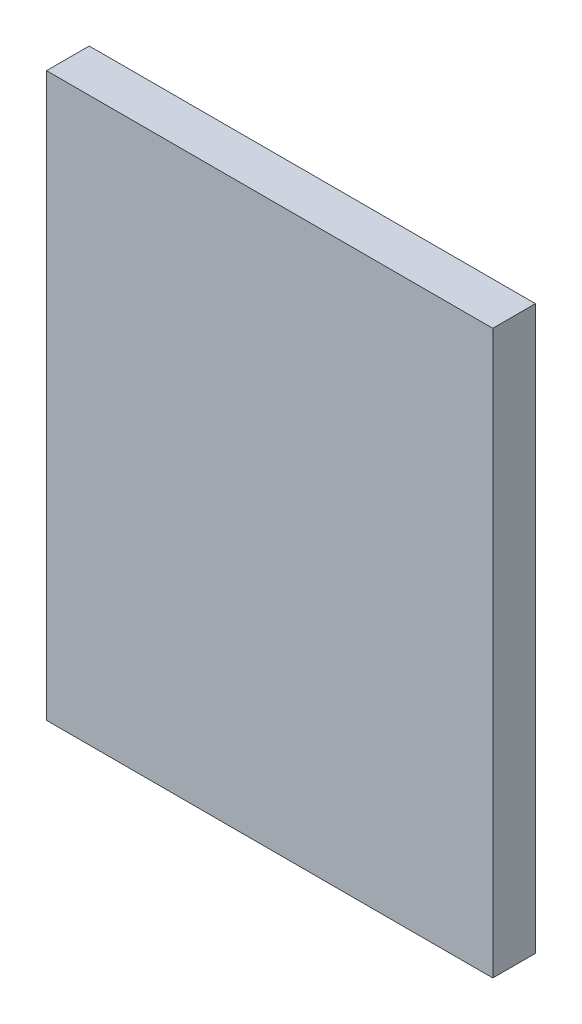
ISO-10303-21;
HEADER;
FILE_DESCRIPTION(('STEP AP214'),'2;1');
FILE_NAME('part.step','',(''),(''),'','','');
FILE_SCHEMA(('AUTOMOTIVE_DESIGN { 1 0 10303 214 1 1 1 1 }'));
ENDSEC;
DATA;
#1=APPLICATION_CONTEXT('core data for automotive mechanical design processes');
#2=APPLICATION_PROTOCOL_DEFINITION('international standard','automotive_design',2000,#1);
#3=PRODUCT_CONTEXT('',#1,'mechanical');
#4=PRODUCT('Part','Part','',(#3));
#5=PRODUCT_RELATED_PRODUCT_CATEGORY('part','',(#4));
#6=PRODUCT_DEFINITION_FORMATION('','',#4);
#7=PRODUCT_DEFINITION_CONTEXT('part definition',#1,'design');
#8=PRODUCT_DEFINITION('design','',#6,#7);
#9=PRODUCT_DEFINITION_SHAPE('','',#8);
#10=(LENGTH_UNIT() NAMED_UNIT(*) SI_UNIT(.MILLI.,.METRE.));
#11=(NAMED_UNIT(*) PLANE_ANGLE_UNIT() SI_UNIT($,.RADIAN.));
#12=(NAMED_UNIT(*) SI_UNIT($,.STERADIAN.) SOLID_ANGLE_UNIT());
#13=UNCERTAINTY_MEASURE_WITH_UNIT(LENGTH_MEASURE(1.E-05),#10,'distance_accuracy_value','');
#14=(GEOMETRIC_REPRESENTATION_CONTEXT(3) GLOBAL_UNCERTAINTY_ASSIGNED_CONTEXT((#13)) GLOBAL_UNIT_ASSIGNED_CONTEXT((#10,
#11,#12)) REPRESENTATION_CONTEXT('',''));
#15=CARTESIAN_POINT('',(0.,0.,0.));
#16=DIRECTION('',(0.,0.,1.));
#17=DIRECTION('',(1.,0.,0.));
#18=AXIS2_PLACEMENT_3D('',#15,#16,#17);
#19=CARTESIAN_POINT('',(19.4,0.,-35.625));
#20=DIRECTION('',(0.,0.,-1.));
#21=DIRECTION('',(-1.,0.,0.));
#22=AXIS2_PLACEMENT_3D('',#19,#20,#21);
#23=PLANE('',#22);
#24=DIRECTION('',(0.,1.,0.));
#25=VECTOR('',#24,1.);
#26=CARTESIAN_POINT('',(12.9,-7.25,-35.625));
#27=LINE('',#26,#25);
#28=CARTESIAN_POINT('',(12.9,-7.25,-35.625));
#29=VERTEX_POINT('',#28);
#30=CARTESIAN_POINT('',(12.9,7.25,-35.625));
#31=VERTEX_POINT('',#30);
#32=EDGE_CURVE('E80',#29,#31,#27,.T.);
#33=ORIENTED_EDGE('',*,*,#32,.F.);
#34=DIRECTION('',(1.,0.,0.));
#35=VECTOR('',#34,1.);
#36=CARTESIAN_POINT('',(25.9,-7.25,-35.625));
#37=LINE('',#36,#35);
#38=CARTESIAN_POINT('',(24.4,-7.25,-35.625));
#39=VERTEX_POINT('',#38);
#40=EDGE_CURVE('E68',#39,#29,#37,.F.);
#41=ORIENTED_EDGE('',*,*,#40,.F.);
#42=DIRECTION('',(0.,1.,0.));
#43=VECTOR('',#42,1.);
#44=CARTESIAN_POINT('',(24.4,7.25,-35.625));
#45=LINE('',#44,#43);
#46=CARTESIAN_POINT('',(24.4,7.25,-35.625));
#47=VERTEX_POINT('',#46);
#48=EDGE_CURVE('E55',#47,#39,#45,.F.);
#49=ORIENTED_EDGE('',*,*,#48,.F.);
#50=DIRECTION('',(1.,0.,0.));
#51=VECTOR('',#50,1.);
#52=CARTESIAN_POINT('',(12.9,7.25,-35.625));
#53=LINE('',#52,#51);
#54=EDGE_CURVE('E20',#31,#47,#53,.T.);
#55=ORIENTED_EDGE('',*,*,#54,.F.);
#56=EDGE_LOOP('',(#33,#41,#49,#55));
#57=FACE_BOUND('',#56,.T.);
#58=ADVANCED_FACE('F17',(#57),#23,.F.);
#59=CARTESIAN_POINT('',(12.9,7.25,-36.425));
#60=DIRECTION('',(0.,1.,0.));
#61=DIRECTION('',(0.,0.,1.));
#62=AXIS2_PLACEMENT_3D('',#59,#60,#61);
#63=PLANE('',#62);
#64=DIRECTION('',(0.,0.,-1.));
#65=VECTOR('',#64,1.);
#66=CARTESIAN_POINT('',(24.4,7.25,-36.425));
#67=LINE('',#66,#65);
#68=CARTESIAN_POINT('',(24.4,7.25,-36.725));
#69=VERTEX_POINT('',#68);
#70=EDGE_CURVE('E61',#69,#47,#67,.F.);
#71=ORIENTED_EDGE('',*,*,#70,.F.);
#72=DIRECTION('',(-1.,0.,0.));
#73=VECTOR('',#72,1.);
#74=CARTESIAN_POINT('',(19.4,7.25,-36.725));
#75=LINE('',#74,#73);
#76=CARTESIAN_POINT('',(12.9,7.25,-36.725));
#77=VERTEX_POINT('',#76);
#78=EDGE_CURVE('E83',#77,#69,#75,.F.);
#79=ORIENTED_EDGE('',*,*,#78,.F.);
#80=DIRECTION('',(0.,0.,1.));
#81=VECTOR('',#80,1.);
#82=CARTESIAN_POINT('',(12.9,7.25,-36.425));
#83=LINE('',#82,#81);
#84=EDGE_CURVE('E64',#31,#77,#83,.F.);
#85=ORIENTED_EDGE('',*,*,#84,.F.);
#86=ORIENTED_EDGE('',*,*,#54,.T.);
#87=EDGE_LOOP('',(#71,#79,#85,#86));
#88=FACE_BOUND('',#87,.T.);
#89=ADVANCED_FACE('F60',(#88),#63,.T.);
#90=CARTESIAN_POINT('',(24.4,7.25,-36.425));
#91=DIRECTION('',(1.,0.,0.));
#92=DIRECTION('',(0.,0.,-1.));
#93=AXIS2_PLACEMENT_3D('',#90,#91,#92);
#94=PLANE('',#93);
#95=DIRECTION('',(0.,0.,-1.));
#96=VECTOR('',#95,1.);
#97=CARTESIAN_POINT('',(24.4,-7.25,-36.425));
#98=LINE('',#97,#96);
#99=CARTESIAN_POINT('',(24.4,-7.25,-36.725));
#100=VERTEX_POINT('',#99);
#101=EDGE_CURVE('E70',#100,#39,#98,.F.);
#102=ORIENTED_EDGE('',*,*,#101,.F.);
#103=DIRECTION('',(0.,1.,0.));
#104=VECTOR('',#103,1.);
#105=CARTESIAN_POINT('',(24.4,0.,-36.725));
#106=LINE('',#105,#104);
#107=EDGE_CURVE('E74',#69,#100,#106,.F.);
#108=ORIENTED_EDGE('',*,*,#107,.F.);
#109=ORIENTED_EDGE('',*,*,#70,.T.);
#110=ORIENTED_EDGE('',*,*,#48,.T.);
#111=EDGE_LOOP('',(#102,#108,#109,#110));
#112=FACE_BOUND('',#111,.T.);
#113=ADVANCED_FACE('F72',(#112),#94,.T.);
#114=CARTESIAN_POINT('',(25.9,-7.25,-36.425));
#115=DIRECTION('',(0.,-1.,0.));
#116=DIRECTION('',(0.,0.,-1.));
#117=AXIS2_PLACEMENT_3D('',#114,#115,#116);
#118=PLANE('',#117);
#119=DIRECTION('',(0.,0.,1.));
#120=VECTOR('',#119,1.);
#121=CARTESIAN_POINT('',(12.9,-7.25,-36.425));
#122=LINE('',#121,#120);
#123=CARTESIAN_POINT('',(12.9,-7.25,-36.725));
#124=VERTEX_POINT('',#123);
#125=EDGE_CURVE('E35',#124,#29,#122,.T.);
#126=ORIENTED_EDGE('',*,*,#125,.F.);
#127=DIRECTION('',(-1.,0.,0.));
#128=VECTOR('',#127,1.);
#129=CARTESIAN_POINT('',(19.4,-7.25,-36.725));
#130=LINE('',#129,#128);
#131=EDGE_CURVE('E26',#100,#124,#130,.T.);
#132=ORIENTED_EDGE('',*,*,#131,.F.);
#133=ORIENTED_EDGE('',*,*,#101,.T.);
#134=ORIENTED_EDGE('',*,*,#40,.T.);
#135=EDGE_LOOP('',(#126,#132,#133,#134));
#136=FACE_BOUND('',#135,.T.);
#137=ADVANCED_FACE('F89',(#136),#118,.T.);
#138=CARTESIAN_POINT('',(12.9,-7.25,-36.425));
#139=DIRECTION('',(-1.,0.,0.));
#140=DIRECTION('',(0.,0.,1.));
#141=AXIS2_PLACEMENT_3D('',#138,#139,#140);
#142=PLANE('',#141);
#143=ORIENTED_EDGE('',*,*,#84,.T.);
#144=DIRECTION('',(0.,1.,0.));
#145=VECTOR('',#144,1.);
#146=CARTESIAN_POINT('',(12.9,0.,-36.725));
#147=LINE('',#146,#145);
#148=EDGE_CURVE('E11',#124,#77,#147,.T.);
#149=ORIENTED_EDGE('',*,*,#148,.F.);
#150=ORIENTED_EDGE('',*,*,#125,.T.);
#151=ORIENTED_EDGE('',*,*,#32,.T.);
#152=EDGE_LOOP('',(#143,#149,#150,#151));
#153=FACE_BOUND('',#152,.T.);
#154=ADVANCED_FACE('F91',(#153),#142,.T.);
#155=CARTESIAN_POINT('',(19.4,0.,-36.725));
#156=DIRECTION('',(0.,0.,-1.));
#157=DIRECTION('',(-1.,0.,0.));
#158=AXIS2_PLACEMENT_3D('',#155,#156,#157);
#159=PLANE('',#158);
#160=ORIENTED_EDGE('',*,*,#131,.T.);
#161=ORIENTED_EDGE('',*,*,#148,.T.);
#162=ORIENTED_EDGE('',*,*,#78,.T.);
#163=ORIENTED_EDGE('',*,*,#107,.T.);
#164=EDGE_LOOP('',(#160,#161,#162,#163));
#165=FACE_BOUND('',#164,.T.);
#166=ADVANCED_FACE('F88',(#165),#159,.T.);
#167=CLOSED_SHELL('',(#58,#89,#113,#137,#154,#166));
#168=MANIFOLD_SOLID_BREP('B1',#167);
#169=ADVANCED_BREP_SHAPE_REPRESENTATION('',(#18,#168),#14);
#170=SHAPE_DEFINITION_REPRESENTATION(#9,#169);
ENDSEC;
END-ISO-10303-21;
